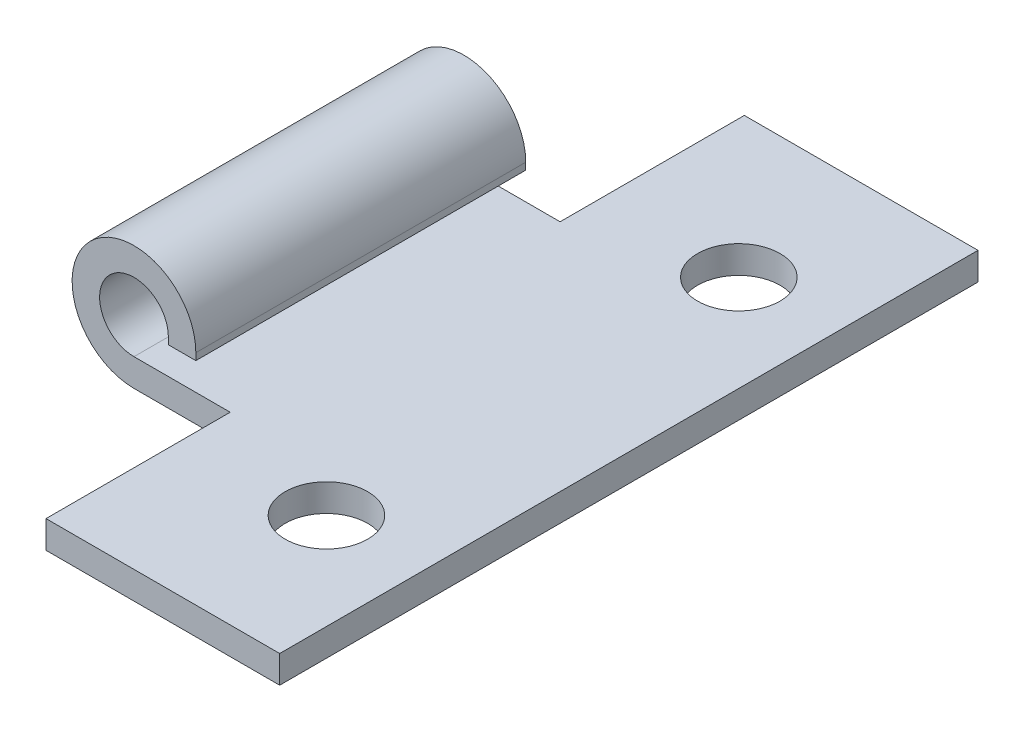
ISO-10303-21;
HEADER;
FILE_DESCRIPTION(('STEP AP214'),'2;1');
FILE_NAME('part.step','',(''),(''),'','','');
FILE_SCHEMA(('AUTOMOTIVE_DESIGN { 1 0 10303 214 1 1 1 1 }'));
ENDSEC;
DATA;
#1=APPLICATION_CONTEXT('core data for automotive mechanical design processes');
#2=APPLICATION_PROTOCOL_DEFINITION('international standard','automotive_design',2000,#1);
#3=PRODUCT_CONTEXT('',#1,'mechanical');
#4=PRODUCT('Part','Part','',(#3));
#5=PRODUCT_RELATED_PRODUCT_CATEGORY('part','',(#4));
#6=PRODUCT_DEFINITION_FORMATION('','',#4);
#7=PRODUCT_DEFINITION_CONTEXT('part definition',#1,'design');
#8=PRODUCT_DEFINITION('design','',#6,#7);
#9=PRODUCT_DEFINITION_SHAPE('','',#8);
#10=(LENGTH_UNIT() NAMED_UNIT(*) SI_UNIT(.MILLI.,.METRE.));
#11=(NAMED_UNIT(*) PLANE_ANGLE_UNIT() SI_UNIT($,.RADIAN.));
#12=(NAMED_UNIT(*) SI_UNIT($,.STERADIAN.) SOLID_ANGLE_UNIT());
#13=UNCERTAINTY_MEASURE_WITH_UNIT(LENGTH_MEASURE(1.E-05),#10,'distance_accuracy_value','');
#14=(GEOMETRIC_REPRESENTATION_CONTEXT(3) GLOBAL_UNCERTAINTY_ASSIGNED_CONTEXT((#13)) GLOBAL_UNIT_ASSIGNED_CONTEXT((#10,
#11,#12)) REPRESENTATION_CONTEXT('',''));
#15=CARTESIAN_POINT('',(0.,0.,0.));
#16=DIRECTION('',(0.,0.,1.));
#17=DIRECTION('',(1.,0.,0.));
#18=AXIS2_PLACEMENT_3D('',#15,#16,#17);
#19=CARTESIAN_POINT('',(0.,0.,25.4));
#20=DIRECTION('',(0.,0.,-1.));
#21=DIRECTION('',(-1.,0.,0.));
#22=AXIS2_PLACEMENT_3D('',#19,#20,#21);
#23=CYLINDRICAL_SURFACE('',#22,1.25);
#24=DIRECTION('',(0.,0.,-1.));
#25=VECTOR('',#24,1.);
#26=CARTESIAN_POINT('',(1.25,0.,25.4));
#27=LINE('',#26,#25);
#28=CARTESIAN_POINT('',(1.25,0.,18.7));
#29=VERTEX_POINT('',#28);
#30=CARTESIAN_POINT('',(1.25,0.,6.7));
#31=VERTEX_POINT('',#30);
#32=EDGE_CURVE('E146',#29,#31,#27,.T.);
#33=ORIENTED_EDGE('',*,*,#32,.F.);
#34=CARTESIAN_POINT('',(0.,0.,18.7));
#35=DIRECTION('',(0.,0.,-1.));
#36=DIRECTION('',(-1.,0.,0.));
#37=AXIS2_PLACEMENT_3D('',#34,#35,#36);
#38=CIRCLE('',#37,1.25);
#39=CARTESIAN_POINT('',(0.,-1.25,18.7));
#40=VERTEX_POINT('',#39);
#41=EDGE_CURVE('E226',#29,#40,#38,.F.);
#42=ORIENTED_EDGE('',*,*,#41,.T.);
#43=DIRECTION('',(0.,0.,-1.));
#44=VECTOR('',#43,1.);
#45=CARTESIAN_POINT('',(0.,-1.25,25.4));
#46=LINE('',#45,#44);
#47=CARTESIAN_POINT('',(0.,-1.25,6.7));
#48=VERTEX_POINT('',#47);
#49=EDGE_CURVE('E179',#40,#48,#46,.T.);
#50=ORIENTED_EDGE('',*,*,#49,.T.);
#51=CARTESIAN_POINT('',(0.,0.,6.7));
#52=DIRECTION('',(0.,0.,1.));
#53=DIRECTION('',(1.,0.,0.));
#54=AXIS2_PLACEMENT_3D('',#51,#52,#53);
#55=CIRCLE('',#54,1.25);
#56=EDGE_CURVE('E214',#48,#31,#55,.F.);
#57=ORIENTED_EDGE('',*,*,#56,.T.);
#58=EDGE_LOOP('',(#33,#42,#50,#57));
#59=FACE_BOUND('',#58,.T.);
#60=ADVANCED_FACE('F47',(#59),#23,.F.);
#61=CARTESIAN_POINT('',(1.25,0.,25.4));
#62=DIRECTION('',(1.,0.,0.));
#63=DIRECTION('',(0.,0.,-1.));
#64=AXIS2_PLACEMENT_3D('',#61,#62,#63);
#65=PLANE('',#64);
#66=DIRECTION('',(0.,0.,-1.));
#67=VECTOR('',#66,1.);
#68=CARTESIAN_POINT('',(1.25,-0.250000000000001,25.4));
#69=LINE('',#68,#67);
#70=CARTESIAN_POINT('',(1.25,-0.250000000000001,18.7));
#71=VERTEX_POINT('',#70);
#72=CARTESIAN_POINT('',(1.25,-0.250000000000001,6.7));
#73=VERTEX_POINT('',#72);
#74=EDGE_CURVE('E201',#71,#73,#69,.T.);
#75=ORIENTED_EDGE('',*,*,#74,.F.);
#76=DIRECTION('',(0.,1.,0.));
#77=VECTOR('',#76,1.);
#78=CARTESIAN_POINT('',(1.25,0.,18.7));
#79=LINE('',#78,#77);
#80=EDGE_CURVE('E230',#71,#29,#79,.T.);
#81=ORIENTED_EDGE('',*,*,#80,.T.);
#82=ORIENTED_EDGE('',*,*,#32,.T.);
#83=DIRECTION('',(0.,-1.,0.));
#84=VECTOR('',#83,1.);
#85=CARTESIAN_POINT('',(1.25,0.,6.7));
#86=LINE('',#85,#84);
#87=EDGE_CURVE('E271',#31,#73,#86,.T.);
#88=ORIENTED_EDGE('',*,*,#87,.T.);
#89=EDGE_LOOP('',(#75,#81,#82,#88));
#90=FACE_BOUND('',#89,.T.);
#91=ADVANCED_FACE('F296',(#90),#65,.F.);
#92=CARTESIAN_POINT('',(2.25,-0.250000000000001,25.4));
#93=DIRECTION('',(0.,1.,0.));
#94=DIRECTION('',(0.,0.,1.));
#95=AXIS2_PLACEMENT_3D('',#92,#93,#94);
#96=PLANE('',#95);
#97=DIRECTION('',(0.,0.,-1.));
#98=VECTOR('',#97,1.);
#99=CARTESIAN_POINT('',(2.25,-0.250000000000001,25.4));
#100=LINE('',#99,#98);
#101=CARTESIAN_POINT('',(2.25,-0.250000000000001,18.7));
#102=VERTEX_POINT('',#101);
#103=CARTESIAN_POINT('',(2.25,-0.250000000000001,6.7));
#104=VERTEX_POINT('',#103);
#105=EDGE_CURVE('E197',#102,#104,#100,.T.);
#106=ORIENTED_EDGE('',*,*,#105,.F.);
#107=DIRECTION('',(-1.,0.,0.));
#108=VECTOR('',#107,1.);
#109=CARTESIAN_POINT('',(2.25,-0.250000000000001,18.7));
#110=LINE('',#109,#108);
#111=EDGE_CURVE('E235',#102,#71,#110,.T.);
#112=ORIENTED_EDGE('',*,*,#111,.T.);
#113=ORIENTED_EDGE('',*,*,#74,.T.);
#114=DIRECTION('',(1.,0.,0.));
#115=VECTOR('',#114,1.);
#116=CARTESIAN_POINT('',(2.25,-0.250000000000001,6.7));
#117=LINE('',#116,#115);
#118=EDGE_CURVE('E275',#73,#104,#117,.T.);
#119=ORIENTED_EDGE('',*,*,#118,.T.);
#120=EDGE_LOOP('',(#106,#112,#113,#119));
#121=FACE_BOUND('',#120,.T.);
#122=ADVANCED_FACE('F292',(#121),#96,.F.);
#123=CARTESIAN_POINT('',(2.25,0.,25.4));
#124=DIRECTION('',(-1.,0.,0.));
#125=DIRECTION('',(0.,0.,1.));
#126=AXIS2_PLACEMENT_3D('',#123,#124,#125);
#127=PLANE('',#126);
#128=DIRECTION('',(0.,0.,-1.));
#129=VECTOR('',#128,1.);
#130=CARTESIAN_POINT('',(2.25,0.,25.4));
#131=LINE('',#130,#129);
#132=CARTESIAN_POINT('',(2.25,0.,18.7));
#133=VERTEX_POINT('',#132);
#134=CARTESIAN_POINT('',(2.25,0.,6.7));
#135=VERTEX_POINT('',#134);
#136=EDGE_CURVE('E193',#133,#135,#131,.T.);
#137=ORIENTED_EDGE('',*,*,#136,.F.);
#138=DIRECTION('',(0.,-1.,0.));
#139=VECTOR('',#138,1.);
#140=CARTESIAN_POINT('',(2.25,0.,18.7));
#141=LINE('',#140,#139);
#142=EDGE_CURVE('E244',#133,#102,#141,.T.);
#143=ORIENTED_EDGE('',*,*,#142,.T.);
#144=ORIENTED_EDGE('',*,*,#105,.T.);
#145=DIRECTION('',(0.,1.,0.));
#146=VECTOR('',#145,1.);
#147=CARTESIAN_POINT('',(2.25,0.,6.7));
#148=LINE('',#147,#146);
#149=EDGE_CURVE('E237',#104,#135,#148,.T.);
#150=ORIENTED_EDGE('',*,*,#149,.T.);
#151=EDGE_LOOP('',(#137,#143,#144,#150));
#152=FACE_BOUND('',#151,.T.);
#153=ADVANCED_FACE('F282',(#152),#127,.F.);
#154=CARTESIAN_POINT('',(0.,0.,25.4));
#155=DIRECTION('',(0.,0.,-1.));
#156=DIRECTION('',(-1.,0.,0.));
#157=AXIS2_PLACEMENT_3D('',#154,#155,#156);
#158=CYLINDRICAL_SURFACE('',#157,2.25);
#159=CARTESIAN_POINT('',(0.,0.,18.7));
#160=DIRECTION('',(0.,0.,-1.));
#161=DIRECTION('',(-1.,0.,0.));
#162=AXIS2_PLACEMENT_3D('',#159,#160,#161);
#163=CIRCLE('',#162,2.25);
#164=CARTESIAN_POINT('',(0.,-2.25,18.7));
#165=VERTEX_POINT('',#164);
#166=EDGE_CURVE('E171',#165,#133,#163,.T.);
#167=ORIENTED_EDGE('',*,*,#166,.T.);
#168=ORIENTED_EDGE('',*,*,#136,.T.);
#169=CARTESIAN_POINT('',(0.,0.,6.7));
#170=DIRECTION('',(0.,0.,1.));
#171=DIRECTION('',(1.,0.,0.));
#172=AXIS2_PLACEMENT_3D('',#169,#170,#171);
#173=CIRCLE('',#172,2.25);
#174=CARTESIAN_POINT('',(0.,-2.25,6.7));
#175=VERTEX_POINT('',#174);
#176=EDGE_CURVE('E231',#135,#175,#173,.T.);
#177=ORIENTED_EDGE('',*,*,#176,.T.);
#178=DIRECTION('',(0.,0.,-1.));
#179=VECTOR('',#178,1.);
#180=CARTESIAN_POINT('',(0.,-2.25,25.4));
#181=LINE('',#180,#179);
#182=EDGE_CURVE('E190',#165,#175,#181,.T.);
#183=ORIENTED_EDGE('',*,*,#182,.F.);
#184=EDGE_LOOP('',(#167,#168,#177,#183));
#185=FACE_BOUND('',#184,.T.);
#186=ADVANCED_FACE('F285',(#185),#158,.T.);
#187=CARTESIAN_POINT('',(0.,-2.25,25.4));
#188=DIRECTION('',(0.,1.,0.));
#189=DIRECTION('',(0.,0.,1.));
#190=AXIS2_PLACEMENT_3D('',#187,#188,#189);
#191=PLANE('',#190);
#192=CARTESIAN_POINT('',(8.5,-2.25,5.2));
#193=DIRECTION('',(0.,-1.,0.));
#194=DIRECTION('',(0.,0.,-1.));
#195=AXIS2_PLACEMENT_3D('',#192,#193,#194);
#196=CIRCLE('',#195,1.5);
#197=CARTESIAN_POINT('',(8.5,-2.25,3.7));
#198=VERTEX_POINT('',#197);
#199=EDGE_CURVE('E441',#198,#198,#196,.T.);
#200=ORIENTED_EDGE('',*,*,#199,.F.);
#201=EDGE_LOOP('',(#200));
#202=FACE_BOUND('',#201,.T.);
#203=CARTESIAN_POINT('',(8.5,-2.25,20.2));
#204=DIRECTION('',(0.,-1.,0.));
#205=DIRECTION('',(0.,0.,-1.));
#206=AXIS2_PLACEMENT_3D('',#203,#204,#205);
#207=CIRCLE('',#206,1.5);
#208=CARTESIAN_POINT('',(8.5,-2.25,18.7));
#209=VERTEX_POINT('',#208);
#210=EDGE_CURVE('E265',#209,#209,#207,.T.);
#211=ORIENTED_EDGE('',*,*,#210,.F.);
#212=EDGE_LOOP('',(#211));
#213=FACE_BOUND('',#212,.T.);
#214=DIRECTION('',(1.,0.,0.));
#215=VECTOR('',#214,1.);
#216=CARTESIAN_POINT('',(0.,-2.25,25.4));
#217=LINE('',#216,#215);
#218=CARTESIAN_POINT('',(3.5,-2.25,25.4));
#219=VERTEX_POINT('',#218);
#220=CARTESIAN_POINT('',(12.,-2.25,25.4));
#221=VERTEX_POINT('',#220);
#222=EDGE_CURVE('E178',#219,#221,#217,.T.);
#223=ORIENTED_EDGE('',*,*,#222,.F.);
#224=DIRECTION('',(0.,0.,1.));
#225=VECTOR('',#224,1.);
#226=CARTESIAN_POINT('',(3.5,-2.25,18.7));
#227=LINE('',#226,#225);
#228=CARTESIAN_POINT('',(3.5,-2.25,18.7));
#229=VERTEX_POINT('',#228);
#230=EDGE_CURVE('E63',#229,#219,#227,.T.);
#231=ORIENTED_EDGE('',*,*,#230,.F.);
#232=DIRECTION('',(1.,0.,0.));
#233=VECTOR('',#232,1.);
#234=CARTESIAN_POINT('',(-2.25,-2.25,18.7));
#235=LINE('',#234,#233);
#236=EDGE_CURVE('E447',#165,#229,#235,.T.);
#237=ORIENTED_EDGE('',*,*,#236,.F.);
#238=ORIENTED_EDGE('',*,*,#182,.T.);
#239=DIRECTION('',(-1.,0.,0.));
#240=VECTOR('',#239,1.);
#241=CARTESIAN_POINT('',(-2.25,-2.25,6.7));
#242=LINE('',#241,#240);
#243=CARTESIAN_POINT('',(3.5,-2.25,6.7));
#244=VERTEX_POINT('',#243);
#245=EDGE_CURVE('E156',#244,#175,#242,.T.);
#246=ORIENTED_EDGE('',*,*,#245,.F.);
#247=DIRECTION('',(0.,0.,1.));
#248=VECTOR('',#247,1.);
#249=CARTESIAN_POINT('',(3.5,-2.25,6.7));
#250=LINE('',#249,#248);
#251=CARTESIAN_POINT('',(3.5,-2.25,0.));
#252=VERTEX_POINT('',#251);
#253=EDGE_CURVE('E139',#252,#244,#250,.T.);
#254=ORIENTED_EDGE('',*,*,#253,.F.);
#255=DIRECTION('',(1.,0.,0.));
#256=VECTOR('',#255,1.);
#257=CARTESIAN_POINT('',(0.,-2.25,0.));
#258=LINE('',#257,#256);
#259=CARTESIAN_POINT('',(12.,-2.25,0.));
#260=VERTEX_POINT('',#259);
#261=EDGE_CURVE('E152',#252,#260,#258,.T.);
#262=ORIENTED_EDGE('',*,*,#261,.T.);
#263=DIRECTION('',(0.,0.,-1.));
#264=VECTOR('',#263,1.);
#265=CARTESIAN_POINT('',(12.,-2.25,25.4));
#266=LINE('',#265,#264);
#267=EDGE_CURVE('E187',#221,#260,#266,.T.);
#268=ORIENTED_EDGE('',*,*,#267,.F.);
#269=EDGE_LOOP('',(#223,#231,#237,#238,#246,#254,#262,#268));
#270=FACE_BOUND('',#269,.T.);
#271=ADVANCED_FACE('F150',(#202,#213,#270),#191,.F.);
#272=CARTESIAN_POINT('',(12.,-2.25,25.4));
#273=DIRECTION('',(-1.,0.,0.));
#274=DIRECTION('',(0.,0.,1.));
#275=AXIS2_PLACEMENT_3D('',#272,#273,#274);
#276=PLANE('',#275);
#277=DIRECTION('',(0.,1.,0.));
#278=VECTOR('',#277,1.);
#279=CARTESIAN_POINT('',(12.,-2.25,0.));
#280=LINE('',#279,#278);
#281=CARTESIAN_POINT('',(12.,-1.25,0.));
#282=VERTEX_POINT('',#281);
#283=EDGE_CURVE('E163',#260,#282,#280,.T.);
#284=ORIENTED_EDGE('',*,*,#283,.T.);
#285=DIRECTION('',(0.,0.,-1.));
#286=VECTOR('',#285,1.);
#287=CARTESIAN_POINT('',(12.,-1.25,25.4));
#288=LINE('',#287,#286);
#289=CARTESIAN_POINT('',(12.,-1.25,25.4));
#290=VERTEX_POINT('',#289);
#291=EDGE_CURVE('E183',#290,#282,#288,.T.);
#292=ORIENTED_EDGE('',*,*,#291,.F.);
#293=DIRECTION('',(0.,1.,0.));
#294=VECTOR('',#293,1.);
#295=CARTESIAN_POINT('',(12.,-2.25,25.4));
#296=LINE('',#295,#294);
#297=EDGE_CURVE('E251',#221,#290,#296,.T.);
#298=ORIENTED_EDGE('',*,*,#297,.F.);
#299=ORIENTED_EDGE('',*,*,#267,.T.);
#300=EDGE_LOOP('',(#284,#292,#298,#299));
#301=FACE_BOUND('',#300,.T.);
#302=ADVANCED_FACE('F310',(#301),#276,.F.);
#303=CARTESIAN_POINT('',(1.87082869338697,-1.25,25.4));
#304=DIRECTION('',(0.,-1.,0.));
#305=DIRECTION('',(1.,0.,0.));
#306=AXIS2_PLACEMENT_3D('',#303,#304,#305);
#307=PLANE('',#306);
#308=CARTESIAN_POINT('',(8.5,-1.25000000000001,5.2));
#309=DIRECTION('',(0.,-1.,0.));
#310=DIRECTION('',(1.,0.,0.));
#311=AXIS2_PLACEMENT_3D('',#308,#309,#310);
#312=CIRCLE('',#311,1.5);
#313=CARTESIAN_POINT('',(10.,-1.25000000000001,5.2));
#314=VERTEX_POINT('',#313);
#315=EDGE_CURVE('E50',#314,#314,#312,.T.);
#316=ORIENTED_EDGE('',*,*,#315,.T.);
#317=EDGE_LOOP('',(#316));
#318=FACE_BOUND('',#317,.T.);
#319=CARTESIAN_POINT('',(8.5,-1.25000000000001,20.2));
#320=DIRECTION('',(0.,-1.,0.));
#321=DIRECTION('',(1.,0.,0.));
#322=AXIS2_PLACEMENT_3D('',#319,#320,#321);
#323=CIRCLE('',#322,1.5);
#324=CARTESIAN_POINT('',(10.,-1.25000000000001,20.2));
#325=VERTEX_POINT('',#324);
#326=EDGE_CURVE('E210',#325,#325,#323,.T.);
#327=ORIENTED_EDGE('',*,*,#326,.T.);
#328=EDGE_LOOP('',(#327));
#329=FACE_BOUND('',#328,.T.);
#330=DIRECTION('',(1.,0.,0.));
#331=VECTOR('',#330,1.);
#332=CARTESIAN_POINT('',(1.87082869338697,-1.25,18.7));
#333=LINE('',#332,#331);
#334=CARTESIAN_POINT('',(3.5,-1.25,18.7));
#335=VERTEX_POINT('',#334);
#336=EDGE_CURVE('E11',#40,#335,#333,.T.);
#337=ORIENTED_EDGE('',*,*,#336,.T.);
#338=DIRECTION('',(0.,0.,1.));
#339=VECTOR('',#338,1.);
#340=CARTESIAN_POINT('',(3.5,-1.25,25.4));
#341=LINE('',#340,#339);
#342=CARTESIAN_POINT('',(3.5,-1.25,25.4));
#343=VERTEX_POINT('',#342);
#344=EDGE_CURVE('E215',#335,#343,#341,.T.);
#345=ORIENTED_EDGE('',*,*,#344,.T.);
#346=DIRECTION('',(-1.,0.,0.));
#347=VECTOR('',#346,1.);
#348=CARTESIAN_POINT('',(12.,-1.25,25.4));
#349=LINE('',#348,#347);
#350=EDGE_CURVE('E173',#290,#343,#349,.T.);
#351=ORIENTED_EDGE('',*,*,#350,.F.);
#352=ORIENTED_EDGE('',*,*,#291,.T.);
#353=DIRECTION('',(-1.,0.,0.));
#354=VECTOR('',#353,1.);
#355=CARTESIAN_POINT('',(1.87082869338697,-1.25,0.));
#356=LINE('',#355,#354);
#357=CARTESIAN_POINT('',(3.5,-1.25,0.));
#358=VERTEX_POINT('',#357);
#359=EDGE_CURVE('E168',#282,#358,#356,.T.);
#360=ORIENTED_EDGE('',*,*,#359,.T.);
#361=DIRECTION('',(0.,0.,1.));
#362=VECTOR('',#361,1.);
#363=CARTESIAN_POINT('',(3.49999999999999,-1.25,25.4));
#364=LINE('',#363,#362);
#365=CARTESIAN_POINT('',(3.5,-1.25,6.7));
#366=VERTEX_POINT('',#365);
#367=EDGE_CURVE('E71',#358,#366,#364,.T.);
#368=ORIENTED_EDGE('',*,*,#367,.T.);
#369=DIRECTION('',(-1.,0.,0.));
#370=VECTOR('',#369,1.);
#371=CARTESIAN_POINT('',(1.87082869338697,-1.25,6.7));
#372=LINE('',#371,#370);
#373=EDGE_CURVE('E56',#366,#48,#372,.T.);
#374=ORIENTED_EDGE('',*,*,#373,.T.);
#375=ORIENTED_EDGE('',*,*,#49,.F.);
#376=EDGE_LOOP('',(#337,#345,#351,#352,#360,#368,#374,#375));
#377=FACE_BOUND('',#376,.T.);
#378=ADVANCED_FACE('F220',(#318,#329,#377),#307,.F.);
#379=CARTESIAN_POINT('',(0.,0.,25.4));
#380=DIRECTION('',(0.,0.,1.));
#381=DIRECTION('',(1.,0.,0.));
#382=AXIS2_PLACEMENT_3D('',#379,#380,#381);
#383=PLANE('',#382);
#384=DIRECTION('',(0.,1.,0.));
#385=VECTOR('',#384,1.);
#386=CARTESIAN_POINT('',(3.5,0.,25.4));
#387=LINE('',#386,#385);
#388=EDGE_CURVE('E145',#219,#343,#387,.T.);
#389=ORIENTED_EDGE('',*,*,#388,.F.);
#390=ORIENTED_EDGE('',*,*,#222,.T.);
#391=ORIENTED_EDGE('',*,*,#297,.T.);
#392=ORIENTED_EDGE('',*,*,#350,.T.);
#393=EDGE_LOOP('',(#389,#390,#391,#392));
#394=FACE_BOUND('',#393,.T.);
#395=ADVANCED_FACE('F259',(#394),#383,.T.);
#396=CARTESIAN_POINT('',(0.,0.,0.));
#397=DIRECTION('',(0.,0.,1.));
#398=DIRECTION('',(1.,0.,0.));
#399=AXIS2_PLACEMENT_3D('',#396,#397,#398);
#400=PLANE('',#399);
#401=ORIENTED_EDGE('',*,*,#261,.F.);
#402=DIRECTION('',(0.,1.,0.));
#403=VECTOR('',#402,1.);
#404=CARTESIAN_POINT('',(3.5,0.,0.));
#405=LINE('',#404,#403);
#406=EDGE_CURVE('E136',#252,#358,#405,.T.);
#407=ORIENTED_EDGE('',*,*,#406,.T.);
#408=ORIENTED_EDGE('',*,*,#359,.F.);
#409=ORIENTED_EDGE('',*,*,#283,.F.);
#410=EDGE_LOOP('',(#401,#407,#408,#409));
#411=FACE_BOUND('',#410,.T.);
#412=ADVANCED_FACE('F161',(#411),#400,.F.);
#413=CARTESIAN_POINT('',(-2.25,2.25,6.7));
#414=DIRECTION('',(0.,0.,1.));
#415=DIRECTION('',(1.,0.,0.));
#416=AXIS2_PLACEMENT_3D('',#413,#414,#415);
#417=PLANE('',#416);
#418=ORIENTED_EDGE('',*,*,#176,.F.);
#419=ORIENTED_EDGE('',*,*,#149,.F.);
#420=ORIENTED_EDGE('',*,*,#118,.F.);
#421=ORIENTED_EDGE('',*,*,#87,.F.);
#422=ORIENTED_EDGE('',*,*,#56,.F.);
#423=ORIENTED_EDGE('',*,*,#373,.F.);
#424=DIRECTION('',(0.,-1.,0.));
#425=VECTOR('',#424,1.);
#426=CARTESIAN_POINT('',(3.5,2.25,6.7));
#427=LINE('',#426,#425);
#428=EDGE_CURVE('E460',#366,#244,#427,.T.);
#429=ORIENTED_EDGE('',*,*,#428,.T.);
#430=ORIENTED_EDGE('',*,*,#245,.T.);
#431=EDGE_LOOP('',(#418,#419,#420,#421,#422,#423,#429,#430));
#432=FACE_BOUND('',#431,.T.);
#433=ADVANCED_FACE('F294',(#432),#417,.F.);
#434=CARTESIAN_POINT('',(3.5,2.25,6.7));
#435=DIRECTION('',(1.,0.,0.));
#436=DIRECTION('',(0.,0.,-1.));
#437=AXIS2_PLACEMENT_3D('',#434,#435,#436);
#438=PLANE('',#437);
#439=ORIENTED_EDGE('',*,*,#406,.F.);
#440=ORIENTED_EDGE('',*,*,#253,.T.);
#441=ORIENTED_EDGE('',*,*,#428,.F.);
#442=ORIENTED_EDGE('',*,*,#367,.F.);
#443=EDGE_LOOP('',(#439,#440,#441,#442));
#444=FACE_BOUND('',#443,.T.);
#445=ADVANCED_FACE('F138',(#444),#438,.F.);
#446=CARTESIAN_POINT('',(-2.25,2.25,18.7));
#447=DIRECTION('',(0.,0.,-1.));
#448=DIRECTION('',(-1.,0.,0.));
#449=AXIS2_PLACEMENT_3D('',#446,#447,#448);
#450=PLANE('',#449);
#451=ORIENTED_EDGE('',*,*,#236,.T.);
#452=DIRECTION('',(0.,-1.,0.));
#453=VECTOR('',#452,1.);
#454=CARTESIAN_POINT('',(3.5,2.25,18.7));
#455=LINE('',#454,#453);
#456=EDGE_CURVE('E158',#335,#229,#455,.T.);
#457=ORIENTED_EDGE('',*,*,#456,.F.);
#458=ORIENTED_EDGE('',*,*,#336,.F.);
#459=ORIENTED_EDGE('',*,*,#41,.F.);
#460=ORIENTED_EDGE('',*,*,#80,.F.);
#461=ORIENTED_EDGE('',*,*,#111,.F.);
#462=ORIENTED_EDGE('',*,*,#142,.F.);
#463=ORIENTED_EDGE('',*,*,#166,.F.);
#464=EDGE_LOOP('',(#451,#457,#458,#459,#460,#461,#462,#463));
#465=FACE_BOUND('',#464,.T.);
#466=ADVANCED_FACE('F290',(#465),#450,.F.);
#467=CARTESIAN_POINT('',(3.5,2.25,18.7));
#468=DIRECTION('',(1.,0.,0.));
#469=DIRECTION('',(0.,0.,-1.));
#470=AXIS2_PLACEMENT_3D('',#467,#468,#469);
#471=PLANE('',#470);
#472=ORIENTED_EDGE('',*,*,#456,.T.);
#473=ORIENTED_EDGE('',*,*,#230,.T.);
#474=ORIENTED_EDGE('',*,*,#388,.T.);
#475=ORIENTED_EDGE('',*,*,#344,.F.);
#476=EDGE_LOOP('',(#472,#473,#474,#475));
#477=FACE_BOUND('',#476,.T.);
#478=ADVANCED_FACE('F326',(#477),#471,.F.);
#479=CARTESIAN_POINT('',(8.5,2.25,20.2));
#480=DIRECTION('',(0.,-1.,0.));
#481=DIRECTION('',(0.,0.,-1.));
#482=AXIS2_PLACEMENT_3D('',#479,#480,#481);
#483=CYLINDRICAL_SURFACE('',#482,1.5);
#484=ORIENTED_EDGE('',*,*,#210,.T.);
#485=EDGE_LOOP('',(#484));
#486=FACE_BOUND('',#485,.T.);
#487=ORIENTED_EDGE('',*,*,#326,.F.);
#488=EDGE_LOOP('',(#487));
#489=FACE_BOUND('',#488,.T.);
#490=ADVANCED_FACE('F322',(#486,#489),#483,.F.);
#491=CARTESIAN_POINT('',(8.5,2.25,5.2));
#492=DIRECTION('',(0.,-1.,0.));
#493=DIRECTION('',(0.,0.,-1.));
#494=AXIS2_PLACEMENT_3D('',#491,#492,#493);
#495=CYLINDRICAL_SURFACE('',#494,1.5);
#496=ORIENTED_EDGE('',*,*,#199,.T.);
#497=EDGE_LOOP('',(#496));
#498=FACE_BOUND('',#497,.T.);
#499=ORIENTED_EDGE('',*,*,#315,.F.);
#500=EDGE_LOOP('',(#499));
#501=FACE_BOUND('',#500,.T.);
#502=ADVANCED_FACE('F325',(#498,#501),#495,.F.);
#503=CLOSED_SHELL('',(#60,#91,#122,#153,#186,#271,#302,#378,#395,#412,#433,#445,#466,#478,#490,#502));
#504=MANIFOLD_SOLID_BREP('B2',#503);
#505=ADVANCED_BREP_SHAPE_REPRESENTATION('',(#18,#504),#14);
#506=SHAPE_DEFINITION_REPRESENTATION(#9,#505);
ENDSEC;
END-ISO-10303-21;
